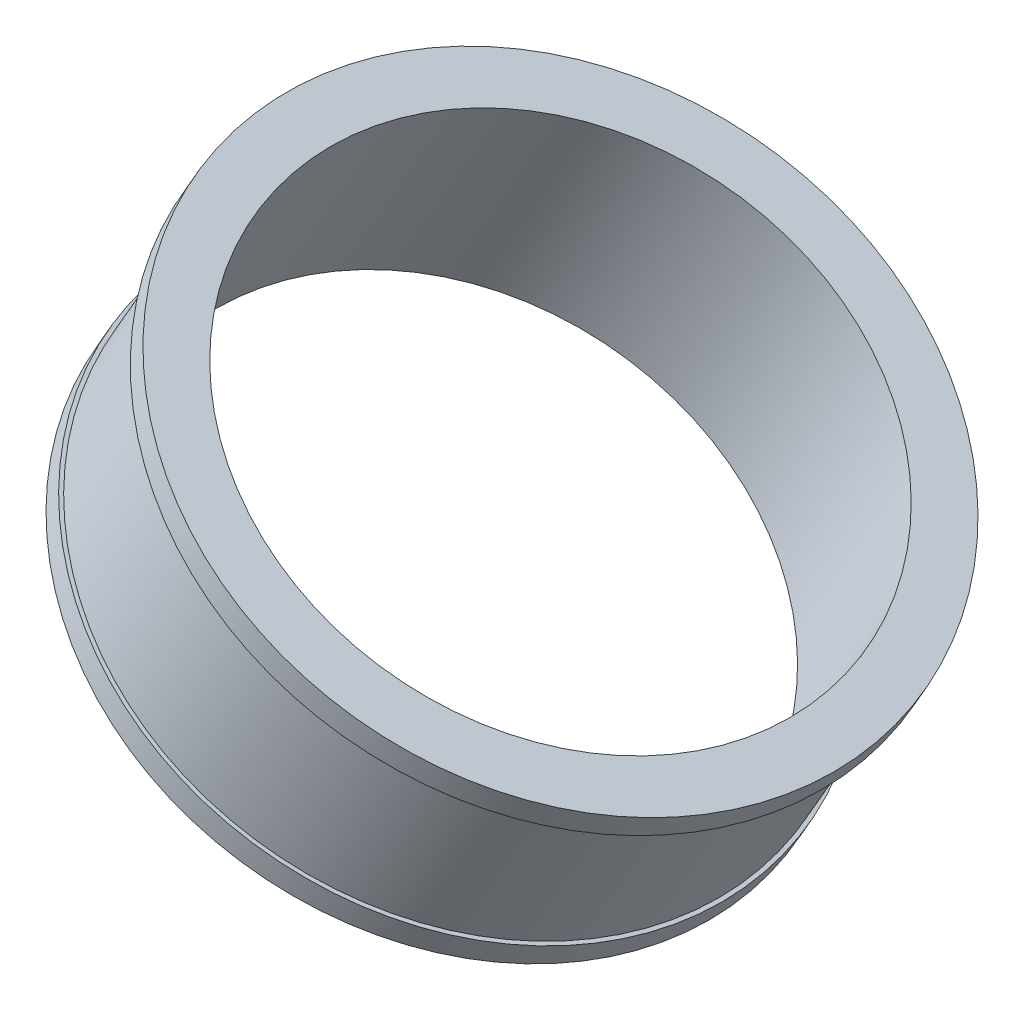
ISO-10303-21;
HEADER;
FILE_DESCRIPTION(('STEP AP214'),'2;1');
FILE_NAME('part.step','',(''),(''),'','','');
FILE_SCHEMA(('AUTOMOTIVE_DESIGN { 1 0 10303 214 1 1 1 1 }'));
ENDSEC;
DATA;
#1=APPLICATION_CONTEXT('core data for automotive mechanical design processes');
#2=APPLICATION_PROTOCOL_DEFINITION('international standard','automotive_design',2000,#1);
#3=PRODUCT_CONTEXT('',#1,'mechanical');
#4=PRODUCT('Part','Part','',(#3));
#5=PRODUCT_RELATED_PRODUCT_CATEGORY('part','',(#4));
#6=PRODUCT_DEFINITION_FORMATION('','',#4);
#7=PRODUCT_DEFINITION_CONTEXT('part definition',#1,'design');
#8=PRODUCT_DEFINITION('design','',#6,#7);
#9=PRODUCT_DEFINITION_SHAPE('','',#8);
#10=(LENGTH_UNIT() NAMED_UNIT(*) SI_UNIT(.MILLI.,.METRE.));
#11=(NAMED_UNIT(*) PLANE_ANGLE_UNIT() SI_UNIT($,.RADIAN.));
#12=(NAMED_UNIT(*) SI_UNIT($,.STERADIAN.) SOLID_ANGLE_UNIT());
#13=UNCERTAINTY_MEASURE_WITH_UNIT(LENGTH_MEASURE(1.E-05),#10,'distance_accuracy_value','');
#14=(GEOMETRIC_REPRESENTATION_CONTEXT(3) GLOBAL_UNCERTAINTY_ASSIGNED_CONTEXT((#13)) GLOBAL_UNIT_ASSIGNED_CONTEXT((#10,
#11,#12)) REPRESENTATION_CONTEXT('',''));
#15=CARTESIAN_POINT('',(0.,0.,0.));
#16=DIRECTION('',(0.,0.,1.));
#17=DIRECTION('',(1.,0.,0.));
#18=AXIS2_PLACEMENT_3D('',#15,#16,#17);
#19=CARTESIAN_POINT('',(137.750000000002,905.922011028831,-386.357743681072));
#20=DIRECTION('',(-0.5,-0.866025403784438,0.));
#21=DIRECTION('',(0.866025403784438,-0.5,0.));
#22=AXIS2_PLACEMENT_3D('',#19,#20,#21);
#23=CYLINDRICAL_SURFACE('',#22,11.85);
#24=CARTESIAN_POINT('',(136.000000000002,902.890922115586,-386.357743681072));
#25=DIRECTION('',(-0.5,-0.866025403784438,0.));
#26=DIRECTION('',(0.866025403784438,-0.5,0.));
#27=AXIS2_PLACEMENT_3D('',#24,#25,#26);
#28=CIRCLE('',#27,11.85);
#29=CARTESIAN_POINT('',(146.262401034848,896.965922115586,-386.357743681072));
#30=VERTEX_POINT('',#29);
#31=EDGE_CURVE('E18',#30,#30,#28,.F.);
#32=ORIENTED_EDGE('',*,*,#31,.T.);
#33=EDGE_LOOP('',(#32));
#34=FACE_BOUND('',#33,.T.);
#35=CARTESIAN_POINT('',(139.500000000002,908.953099942077,-386.357743681072));
#36=DIRECTION('',(-0.5,-0.866025403784438,0.));
#37=DIRECTION('',(0.866025403784438,-0.5,0.));
#38=AXIS2_PLACEMENT_3D('',#35,#36,#37);
#39=CIRCLE('',#38,11.85);
#40=CARTESIAN_POINT('',(149.762401034848,903.028099942077,-386.357743681072));
#41=VERTEX_POINT('',#40);
#42=EDGE_CURVE('E40',#41,#41,#39,.F.);
#43=ORIENTED_EDGE('',*,*,#42,.F.);
#44=EDGE_LOOP('',(#43));
#45=FACE_BOUND('',#44,.T.);
#46=ADVANCED_FACE('F15',(#34,#45),#23,.T.);
#47=CARTESIAN_POINT('',(136.000000000002,902.890922115586,-386.357743681072));
#48=DIRECTION('',(-0.5,-0.866025403784438,0.));
#49=DIRECTION('',(0.866025403784438,-0.5,0.));
#50=AXIS2_PLACEMENT_3D('',#47,#48,#49);
#51=PLANE('',#50);
#52=ORIENTED_EDGE('',*,*,#31,.F.);
#53=EDGE_LOOP('',(#52));
#54=FACE_BOUND('',#53,.T.);
#55=CARTESIAN_POINT('',(136.000000000002,902.890922115586,-386.357743681072));
#56=DIRECTION('',(-0.5,-0.866025403784438,0.));
#57=DIRECTION('',(0.866025403784438,-0.5,0.));
#58=AXIS2_PLACEMENT_3D('',#55,#56,#57);
#59=CIRCLE('',#58,12.);
#60=CARTESIAN_POINT('',(146.392304845415,896.890922115586,-386.357743681072));
#61=VERTEX_POINT('',#60);
#62=EDGE_CURVE('E38',#61,#61,#59,.T.);
#63=ORIENTED_EDGE('',*,*,#62,.F.);
#64=EDGE_LOOP('',(#63));
#65=FACE_BOUND('',#64,.T.);
#66=ADVANCED_FACE('F49',(#54,#65),#51,.F.);
#67=CARTESIAN_POINT('',(139.500000000002,908.953099942077,-386.357743681072));
#68=DIRECTION('',(-0.5,-0.866025403784438,0.));
#69=DIRECTION('',(0.866025403784438,-0.5,0.));
#70=AXIS2_PLACEMENT_3D('',#67,#68,#69);
#71=PLANE('',#70);
#72=ORIENTED_EDGE('',*,*,#42,.T.);
#73=EDGE_LOOP('',(#72));
#74=FACE_BOUND('',#73,.T.);
#75=CARTESIAN_POINT('',(139.500000000002,908.953099942077,-386.357743681072));
#76=DIRECTION('',(-0.5,-0.866025403784438,0.));
#77=DIRECTION('',(0.866025403784438,-0.5,0.));
#78=AXIS2_PLACEMENT_3D('',#75,#76,#77);
#79=CIRCLE('',#78,12.5);
#80=CARTESIAN_POINT('',(150.325317547308,902.703099942077,-386.357743681072));
#81=VERTEX_POINT('',#80);
#82=EDGE_CURVE('E35',#81,#81,#79,.F.);
#83=ORIENTED_EDGE('',*,*,#82,.F.);
#84=EDGE_LOOP('',(#83));
#85=FACE_BOUND('',#84,.T.);
#86=ADVANCED_FACE('F52',(#74,#85),#71,.T.);
#87=CARTESIAN_POINT('',(137.500000000002,905.488998326939,-386.357743681072));
#88=DIRECTION('',(-0.5,-0.866025403784438,0.));
#89=DIRECTION('',(0.866025403784438,-0.5,0.));
#90=AXIS2_PLACEMENT_3D('',#87,#88,#89);
#91=CYLINDRICAL_SURFACE('',#90,12.);
#92=CARTESIAN_POINT('',(135.500000000002,902.024896711801,-386.357743681072));
#93=DIRECTION('',(-0.5,-0.866025403784438,0.));
#94=DIRECTION('',(0.866025403784438,-0.5,0.));
#95=AXIS2_PLACEMENT_3D('',#92,#93,#94);
#96=CIRCLE('',#95,12.);
#97=CARTESIAN_POINT('',(145.892304845415,896.024896711801,-386.357743681072));
#98=VERTEX_POINT('',#97);
#99=EDGE_CURVE('E32',#98,#98,#96,.T.);
#100=ORIENTED_EDGE('',*,*,#99,.F.);
#101=EDGE_LOOP('',(#100));
#102=FACE_BOUND('',#101,.T.);
#103=ORIENTED_EDGE('',*,*,#62,.T.);
#104=EDGE_LOOP('',(#103));
#105=FACE_BOUND('',#104,.T.);
#106=ADVANCED_FACE('F55',(#102,#105),#91,.T.);
#107=CARTESIAN_POINT('',(139.750000000002,909.386112643969,-386.357743681072));
#108=DIRECTION('',(-0.5,-0.866025403784438,0.));
#109=DIRECTION('',(0.866025403784438,-0.5,0.));
#110=AXIS2_PLACEMENT_3D('',#107,#108,#109);
#111=CYLINDRICAL_SURFACE('',#110,12.5);
#112=CARTESIAN_POINT('',(140.000000000002,909.819125345861,-386.357743681072));
#113=DIRECTION('',(-0.5,-0.866025403784438,0.));
#114=DIRECTION('',(0.866025403784438,-0.5,0.));
#115=AXIS2_PLACEMENT_3D('',#112,#113,#114);
#116=CIRCLE('',#115,12.5);
#117=CARTESIAN_POINT('',(150.825317547307,903.569125345861,-386.357743681072));
#118=VERTEX_POINT('',#117);
#119=EDGE_CURVE('E27',#118,#118,#116,.F.);
#120=ORIENTED_EDGE('',*,*,#119,.F.);
#121=EDGE_LOOP('',(#120));
#122=FACE_BOUND('',#121,.T.);
#123=ORIENTED_EDGE('',*,*,#82,.T.);
#124=EDGE_LOOP('',(#123));
#125=FACE_BOUND('',#124,.T.);
#126=ADVANCED_FACE('F57',(#122,#125),#111,.T.);
#127=CARTESIAN_POINT('',(135.500000000002,902.024896711801,-386.357743681072));
#128=DIRECTION('',(-0.5,-0.866025403784438,0.));
#129=DIRECTION('',(0.866025403784438,-0.5,0.));
#130=AXIS2_PLACEMENT_3D('',#127,#128,#129);
#131=PLANE('',#130);
#132=CARTESIAN_POINT('',(135.500000000002,902.024896711801,-386.357743681072));
#133=DIRECTION('',(-0.5,-0.866025403784438,0.));
#134=DIRECTION('',(0.866025403784438,-0.5,0.));
#135=AXIS2_PLACEMENT_3D('',#132,#133,#134);
#136=CIRCLE('',#135,10.5);
#137=CARTESIAN_POINT('',(144.593266739738,896.774896711801,-386.357743681072));
#138=VERTEX_POINT('',#137);
#139=EDGE_CURVE('E22',#138,#138,#136,.F.);
#140=ORIENTED_EDGE('',*,*,#139,.T.);
#141=EDGE_LOOP('',(#140));
#142=FACE_BOUND('',#141,.T.);
#143=ORIENTED_EDGE('',*,*,#99,.T.);
#144=EDGE_LOOP('',(#143));
#145=FACE_BOUND('',#144,.T.);
#146=ADVANCED_FACE('F65',(#142,#145),#131,.T.);
#147=CARTESIAN_POINT('',(140.000000000002,909.819125345861,-386.357743681072));
#148=DIRECTION('',(0.5,0.866025403784438,0.));
#149=DIRECTION('',(-0.866025403784438,0.5,0.));
#150=AXIS2_PLACEMENT_3D('',#147,#148,#149);
#151=PLANE('',#150);
#152=CARTESIAN_POINT('',(140.000000000002,909.819125345861,-386.357743681072));
#153=DIRECTION('',(-0.5,-0.866025403784438,0.));
#154=DIRECTION('',(0.866025403784438,-0.5,0.));
#155=AXIS2_PLACEMENT_3D('',#152,#153,#154);
#156=CIRCLE('',#155,10.5);
#157=CARTESIAN_POINT('',(149.093266739739,904.569125345861,-386.357743681072));
#158=VERTEX_POINT('',#157);
#159=EDGE_CURVE('E10',#158,#158,#156,.T.);
#160=ORIENTED_EDGE('',*,*,#159,.T.);
#161=EDGE_LOOP('',(#160));
#162=FACE_BOUND('',#161,.T.);
#163=ORIENTED_EDGE('',*,*,#119,.T.);
#164=EDGE_LOOP('',(#163));
#165=FACE_BOUND('',#164,.T.);
#166=ADVANCED_FACE('F72',(#162,#165),#151,.T.);
#167=CARTESIAN_POINT('',(137.750000000002,905.922011028831,-386.357743681072));
#168=DIRECTION('',(-0.5,-0.866025403784438,0.));
#169=DIRECTION('',(0.866025403784438,-0.5,0.));
#170=AXIS2_PLACEMENT_3D('',#167,#168,#169);
#171=CYLINDRICAL_SURFACE('',#170,10.5);
#172=ORIENTED_EDGE('',*,*,#159,.F.);
#173=EDGE_LOOP('',(#172));
#174=FACE_BOUND('',#173,.T.);
#175=ORIENTED_EDGE('',*,*,#139,.F.);
#176=EDGE_LOOP('',(#175));
#177=FACE_BOUND('',#176,.T.);
#178=ADVANCED_FACE('F70',(#174,#177),#171,.F.);
#179=CLOSED_SHELL('',(#46,#66,#86,#106,#126,#146,#166,#178));
#180=MANIFOLD_SOLID_BREP('B1',#179);
#181=ADVANCED_BREP_SHAPE_REPRESENTATION('',(#18,#180),#14);
#182=SHAPE_DEFINITION_REPRESENTATION(#9,#181);
ENDSEC;
END-ISO-10303-21;
